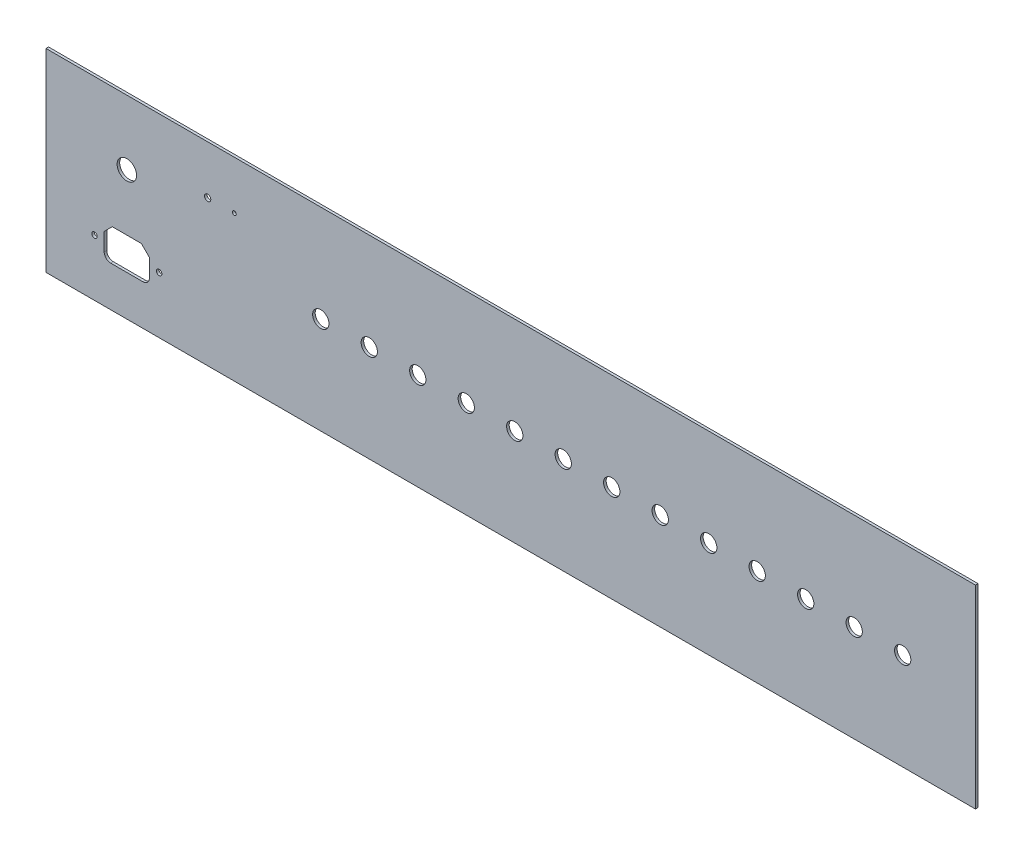
ISO-10303-21;
HEADER;
FILE_DESCRIPTION(('STEP AP214'),'2;1');
FILE_NAME('part.step','',(''),(''),'','','');
FILE_SCHEMA(('AUTOMOTIVE_DESIGN { 1 0 10303 214 1 1 1 1 }'));
ENDSEC;
DATA;
#1=APPLICATION_CONTEXT('core data for automotive mechanical design processes');
#2=APPLICATION_PROTOCOL_DEFINITION('international standard','automotive_design',2000,#1);
#3=PRODUCT_CONTEXT('',#1,'mechanical');
#4=PRODUCT('Part','Part','',(#3));
#5=PRODUCT_RELATED_PRODUCT_CATEGORY('part','',(#4));
#6=PRODUCT_DEFINITION_FORMATION('','',#4);
#7=PRODUCT_DEFINITION_CONTEXT('part definition',#1,'design');
#8=PRODUCT_DEFINITION('design','',#6,#7);
#9=PRODUCT_DEFINITION_SHAPE('','',#8);
#10=(LENGTH_UNIT() NAMED_UNIT(*) SI_UNIT(.MILLI.,.METRE.));
#11=(NAMED_UNIT(*) PLANE_ANGLE_UNIT() SI_UNIT($,.RADIAN.));
#12=(NAMED_UNIT(*) SI_UNIT($,.STERADIAN.) SOLID_ANGLE_UNIT());
#13=UNCERTAINTY_MEASURE_WITH_UNIT(LENGTH_MEASURE(1.E-05),#10,'distance_accuracy_value','');
#14=(GEOMETRIC_REPRESENTATION_CONTEXT(3) GLOBAL_UNCERTAINTY_ASSIGNED_CONTEXT((#13)) GLOBAL_UNIT_ASSIGNED_CONTEXT((#10,
#11,#12)) REPRESENTATION_CONTEXT('',''));
#15=CARTESIAN_POINT('',(0.,0.,0.));
#16=DIRECTION('',(0.,0.,1.));
#17=DIRECTION('',(1.,0.,0.));
#18=AXIS2_PLACEMENT_3D('',#15,#16,#17);
#19=CARTESIAN_POINT('',(242.5,0.,1.5875));
#20=DIRECTION('',(0.,0.,1.));
#21=DIRECTION('',(1.,0.,0.));
#22=AXIS2_PLACEMENT_3D('',#19,#20,#21);
#23=CYLINDRICAL_SURFACE('',#22,5.0419);
#24=CARTESIAN_POINT('',(242.5,0.,0.));
#25=DIRECTION('',(0.,0.,1.));
#26=DIRECTION('',(1.,0.,0.));
#27=AXIS2_PLACEMENT_3D('',#24,#25,#26);
#28=CIRCLE('',#27,5.0419);
#29=CARTESIAN_POINT('',(247.5419,0.,0.));
#30=VERTEX_POINT('',#29);
#31=EDGE_CURVE('E214',#30,#30,#28,.T.);
#32=ORIENTED_EDGE('',*,*,#31,.F.);
#33=EDGE_LOOP('',(#32));
#34=FACE_BOUND('',#33,.T.);
#35=CARTESIAN_POINT('',(242.5,0.,1.5875));
#36=DIRECTION('',(0.,0.,1.));
#37=DIRECTION('',(1.,0.,0.));
#38=AXIS2_PLACEMENT_3D('',#35,#36,#37);
#39=CIRCLE('',#38,5.0419);
#40=CARTESIAN_POINT('',(247.5419,0.,1.5875));
#41=VERTEX_POINT('',#40);
#42=EDGE_CURVE('E217',#41,#41,#39,.T.);
#43=ORIENTED_EDGE('',*,*,#42,.T.);
#44=EDGE_LOOP('',(#43));
#45=FACE_BOUND('',#44,.T.);
#46=ADVANCED_FACE('F34',(#34,#45),#23,.F.);
#47=CARTESIAN_POINT('',(212.5,0.,1.5875));
#48=DIRECTION('',(0.,0.,1.));
#49=DIRECTION('',(1.,0.,0.));
#50=AXIS2_PLACEMENT_3D('',#47,#48,#49);
#51=CYLINDRICAL_SURFACE('',#50,5.0419);
#52=CARTESIAN_POINT('',(212.5,0.,0.));
#53=DIRECTION('',(0.,0.,1.));
#54=DIRECTION('',(1.,0.,0.));
#55=AXIS2_PLACEMENT_3D('',#52,#53,#54);
#56=CIRCLE('',#55,5.0419);
#57=CARTESIAN_POINT('',(217.5419,0.,0.));
#58=VERTEX_POINT('',#57);
#59=EDGE_CURVE('E208',#58,#58,#56,.T.);
#60=ORIENTED_EDGE('',*,*,#59,.F.);
#61=EDGE_LOOP('',(#60));
#62=FACE_BOUND('',#61,.T.);
#63=CARTESIAN_POINT('',(212.5,0.,1.5875));
#64=DIRECTION('',(0.,0.,1.));
#65=DIRECTION('',(1.,0.,0.));
#66=AXIS2_PLACEMENT_3D('',#63,#64,#65);
#67=CIRCLE('',#66,5.0419);
#68=CARTESIAN_POINT('',(217.5419,0.,1.5875));
#69=VERTEX_POINT('',#68);
#70=EDGE_CURVE('E211',#69,#69,#67,.T.);
#71=ORIENTED_EDGE('',*,*,#70,.T.);
#72=EDGE_LOOP('',(#71));
#73=FACE_BOUND('',#72,.T.);
#74=ADVANCED_FACE('F350',(#62,#73),#51,.F.);
#75=CARTESIAN_POINT('',(182.5,0.,1.5875));
#76=DIRECTION('',(0.,0.,1.));
#77=DIRECTION('',(1.,0.,0.));
#78=AXIS2_PLACEMENT_3D('',#75,#76,#77);
#79=CYLINDRICAL_SURFACE('',#78,5.0419);
#80=CARTESIAN_POINT('',(182.5,0.,0.));
#81=DIRECTION('',(0.,0.,1.));
#82=DIRECTION('',(1.,0.,0.));
#83=AXIS2_PLACEMENT_3D('',#80,#81,#82);
#84=CIRCLE('',#83,5.0419);
#85=CARTESIAN_POINT('',(187.5419,0.,0.));
#86=VERTEX_POINT('',#85);
#87=EDGE_CURVE('E202',#86,#86,#84,.T.);
#88=ORIENTED_EDGE('',*,*,#87,.F.);
#89=EDGE_LOOP('',(#88));
#90=FACE_BOUND('',#89,.T.);
#91=CARTESIAN_POINT('',(182.5,0.,1.5875));
#92=DIRECTION('',(0.,0.,1.));
#93=DIRECTION('',(1.,0.,0.));
#94=AXIS2_PLACEMENT_3D('',#91,#92,#93);
#95=CIRCLE('',#94,5.0419);
#96=CARTESIAN_POINT('',(187.5419,0.,1.5875));
#97=VERTEX_POINT('',#96);
#98=EDGE_CURVE('E205',#97,#97,#95,.T.);
#99=ORIENTED_EDGE('',*,*,#98,.T.);
#100=EDGE_LOOP('',(#99));
#101=FACE_BOUND('',#100,.T.);
#102=ADVANCED_FACE('F356',(#90,#101),#79,.F.);
#103=CARTESIAN_POINT('',(152.5,0.,1.5875));
#104=DIRECTION('',(0.,0.,1.));
#105=DIRECTION('',(1.,0.,0.));
#106=AXIS2_PLACEMENT_3D('',#103,#104,#105);
#107=CYLINDRICAL_SURFACE('',#106,5.0419);
#108=CARTESIAN_POINT('',(152.5,0.,0.));
#109=DIRECTION('',(0.,0.,1.));
#110=DIRECTION('',(1.,0.,0.));
#111=AXIS2_PLACEMENT_3D('',#108,#109,#110);
#112=CIRCLE('',#111,5.0419);
#113=CARTESIAN_POINT('',(157.5419,0.,0.));
#114=VERTEX_POINT('',#113);
#115=EDGE_CURVE('E196',#114,#114,#112,.T.);
#116=ORIENTED_EDGE('',*,*,#115,.F.);
#117=EDGE_LOOP('',(#116));
#118=FACE_BOUND('',#117,.T.);
#119=CARTESIAN_POINT('',(152.5,0.,1.5875));
#120=DIRECTION('',(0.,0.,1.));
#121=DIRECTION('',(1.,0.,0.));
#122=AXIS2_PLACEMENT_3D('',#119,#120,#121);
#123=CIRCLE('',#122,5.0419);
#124=CARTESIAN_POINT('',(157.5419,0.,1.5875));
#125=VERTEX_POINT('',#124);
#126=EDGE_CURVE('E199',#125,#125,#123,.T.);
#127=ORIENTED_EDGE('',*,*,#126,.T.);
#128=EDGE_LOOP('',(#127));
#129=FACE_BOUND('',#128,.T.);
#130=ADVANCED_FACE('F592',(#118,#129),#107,.F.);
#131=CARTESIAN_POINT('',(122.5,0.,1.5875));
#132=DIRECTION('',(0.,0.,1.));
#133=DIRECTION('',(1.,0.,0.));
#134=AXIS2_PLACEMENT_3D('',#131,#132,#133);
#135=CYLINDRICAL_SURFACE('',#134,5.0419);
#136=CARTESIAN_POINT('',(122.5,0.,0.));
#137=DIRECTION('',(0.,0.,1.));
#138=DIRECTION('',(1.,0.,0.));
#139=AXIS2_PLACEMENT_3D('',#136,#137,#138);
#140=CIRCLE('',#139,5.0419);
#141=CARTESIAN_POINT('',(127.5419,0.,0.));
#142=VERTEX_POINT('',#141);
#143=EDGE_CURVE('E190',#142,#142,#140,.T.);
#144=ORIENTED_EDGE('',*,*,#143,.F.);
#145=EDGE_LOOP('',(#144));
#146=FACE_BOUND('',#145,.T.);
#147=CARTESIAN_POINT('',(122.5,0.,1.5875));
#148=DIRECTION('',(0.,0.,1.));
#149=DIRECTION('',(1.,0.,0.));
#150=AXIS2_PLACEMENT_3D('',#147,#148,#149);
#151=CIRCLE('',#150,5.0419);
#152=CARTESIAN_POINT('',(127.5419,0.,1.5875));
#153=VERTEX_POINT('',#152);
#154=EDGE_CURVE('E193',#153,#153,#151,.T.);
#155=ORIENTED_EDGE('',*,*,#154,.T.);
#156=EDGE_LOOP('',(#155));
#157=FACE_BOUND('',#156,.T.);
#158=ADVANCED_FACE('F583',(#146,#157),#135,.F.);
#159=CARTESIAN_POINT('',(92.5000000000001,0.,1.5875));
#160=DIRECTION('',(0.,0.,1.));
#161=DIRECTION('',(1.,0.,0.));
#162=AXIS2_PLACEMENT_3D('',#159,#160,#161);
#163=CYLINDRICAL_SURFACE('',#162,5.0419);
#164=CARTESIAN_POINT('',(92.5000000000001,0.,0.));
#165=DIRECTION('',(0.,0.,1.));
#166=DIRECTION('',(1.,0.,0.));
#167=AXIS2_PLACEMENT_3D('',#164,#165,#166);
#168=CIRCLE('',#167,5.0419);
#169=CARTESIAN_POINT('',(97.5419000000001,0.,0.));
#170=VERTEX_POINT('',#169);
#171=EDGE_CURVE('E184',#170,#170,#168,.T.);
#172=ORIENTED_EDGE('',*,*,#171,.F.);
#173=EDGE_LOOP('',(#172));
#174=FACE_BOUND('',#173,.T.);
#175=CARTESIAN_POINT('',(92.5000000000001,0.,1.5875));
#176=DIRECTION('',(0.,0.,1.));
#177=DIRECTION('',(1.,0.,0.));
#178=AXIS2_PLACEMENT_3D('',#175,#176,#177);
#179=CIRCLE('',#178,5.0419);
#180=CARTESIAN_POINT('',(97.5419000000001,0.,1.5875));
#181=VERTEX_POINT('',#180);
#182=EDGE_CURVE('E187',#181,#181,#179,.T.);
#183=ORIENTED_EDGE('',*,*,#182,.T.);
#184=EDGE_LOOP('',(#183));
#185=FACE_BOUND('',#184,.T.);
#186=ADVANCED_FACE('F574',(#174,#185),#163,.F.);
#187=CARTESIAN_POINT('',(62.5000000000001,0.,1.5875));
#188=DIRECTION('',(0.,0.,1.));
#189=DIRECTION('',(1.,0.,0.));
#190=AXIS2_PLACEMENT_3D('',#187,#188,#189);
#191=CYLINDRICAL_SURFACE('',#190,5.0419);
#192=CARTESIAN_POINT('',(62.5000000000001,0.,0.));
#193=DIRECTION('',(0.,0.,1.));
#194=DIRECTION('',(1.,0.,0.));
#195=AXIS2_PLACEMENT_3D('',#192,#193,#194);
#196=CIRCLE('',#195,5.0419);
#197=CARTESIAN_POINT('',(67.5419000000001,0.,0.));
#198=VERTEX_POINT('',#197);
#199=EDGE_CURVE('E178',#198,#198,#196,.T.);
#200=ORIENTED_EDGE('',*,*,#199,.F.);
#201=EDGE_LOOP('',(#200));
#202=FACE_BOUND('',#201,.T.);
#203=CARTESIAN_POINT('',(62.5000000000001,0.,1.5875));
#204=DIRECTION('',(0.,0.,1.));
#205=DIRECTION('',(1.,0.,0.));
#206=AXIS2_PLACEMENT_3D('',#203,#204,#205);
#207=CIRCLE('',#206,5.0419);
#208=CARTESIAN_POINT('',(67.5419000000001,0.,1.5875));
#209=VERTEX_POINT('',#208);
#210=EDGE_CURVE('E181',#209,#209,#207,.T.);
#211=ORIENTED_EDGE('',*,*,#210,.T.);
#212=EDGE_LOOP('',(#211));
#213=FACE_BOUND('',#212,.T.);
#214=ADVANCED_FACE('F565',(#202,#213),#191,.F.);
#215=CARTESIAN_POINT('',(32.5000000000001,0.,1.5875));
#216=DIRECTION('',(0.,0.,1.));
#217=DIRECTION('',(1.,0.,0.));
#218=AXIS2_PLACEMENT_3D('',#215,#216,#217);
#219=CYLINDRICAL_SURFACE('',#218,5.0419);
#220=CARTESIAN_POINT('',(32.5000000000001,0.,0.));
#221=DIRECTION('',(0.,0.,1.));
#222=DIRECTION('',(1.,0.,0.));
#223=AXIS2_PLACEMENT_3D('',#220,#221,#222);
#224=CIRCLE('',#223,5.0419);
#225=CARTESIAN_POINT('',(37.5419000000001,0.,0.));
#226=VERTEX_POINT('',#225);
#227=EDGE_CURVE('E172',#226,#226,#224,.T.);
#228=ORIENTED_EDGE('',*,*,#227,.F.);
#229=EDGE_LOOP('',(#228));
#230=FACE_BOUND('',#229,.T.);
#231=CARTESIAN_POINT('',(32.5000000000001,0.,1.5875));
#232=DIRECTION('',(0.,0.,1.));
#233=DIRECTION('',(1.,0.,0.));
#234=AXIS2_PLACEMENT_3D('',#231,#232,#233);
#235=CIRCLE('',#234,5.0419);
#236=CARTESIAN_POINT('',(37.5419000000001,0.,1.5875));
#237=VERTEX_POINT('',#236);
#238=EDGE_CURVE('E175',#237,#237,#235,.T.);
#239=ORIENTED_EDGE('',*,*,#238,.T.);
#240=EDGE_LOOP('',(#239));
#241=FACE_BOUND('',#240,.T.);
#242=ADVANCED_FACE('F556',(#230,#241),#219,.F.);
#243=CARTESIAN_POINT('',(2.50000000000009,0.,1.5875));
#244=DIRECTION('',(0.,0.,1.));
#245=DIRECTION('',(1.,0.,0.));
#246=AXIS2_PLACEMENT_3D('',#243,#244,#245);
#247=CYLINDRICAL_SURFACE('',#246,5.0419);
#248=CARTESIAN_POINT('',(2.50000000000009,0.,0.));
#249=DIRECTION('',(0.,0.,1.));
#250=DIRECTION('',(1.,0.,0.));
#251=AXIS2_PLACEMENT_3D('',#248,#249,#250);
#252=CIRCLE('',#251,5.0419);
#253=CARTESIAN_POINT('',(7.54190000000009,0.,0.));
#254=VERTEX_POINT('',#253);
#255=EDGE_CURVE('E166',#254,#254,#252,.T.);
#256=ORIENTED_EDGE('',*,*,#255,.F.);
#257=EDGE_LOOP('',(#256));
#258=FACE_BOUND('',#257,.T.);
#259=CARTESIAN_POINT('',(2.50000000000009,0.,1.5875));
#260=DIRECTION('',(0.,0.,1.));
#261=DIRECTION('',(1.,0.,0.));
#262=AXIS2_PLACEMENT_3D('',#259,#260,#261);
#263=CIRCLE('',#262,5.0419);
#264=CARTESIAN_POINT('',(7.54190000000009,0.,1.5875));
#265=VERTEX_POINT('',#264);
#266=EDGE_CURVE('E169',#265,#265,#263,.T.);
#267=ORIENTED_EDGE('',*,*,#266,.T.);
#268=EDGE_LOOP('',(#267));
#269=FACE_BOUND('',#268,.T.);
#270=ADVANCED_FACE('F547',(#258,#269),#247,.F.);
#271=CARTESIAN_POINT('',(-27.4999999999999,0.,1.5875));
#272=DIRECTION('',(0.,0.,1.));
#273=DIRECTION('',(1.,0.,0.));
#274=AXIS2_PLACEMENT_3D('',#271,#272,#273);
#275=CYLINDRICAL_SURFACE('',#274,5.0419);
#276=CARTESIAN_POINT('',(-27.4999999999999,0.,0.));
#277=DIRECTION('',(0.,0.,1.));
#278=DIRECTION('',(1.,0.,0.));
#279=AXIS2_PLACEMENT_3D('',#276,#277,#278);
#280=CIRCLE('',#279,5.0419);
#281=CARTESIAN_POINT('',(-22.4580999999999,0.,0.));
#282=VERTEX_POINT('',#281);
#283=EDGE_CURVE('E160',#282,#282,#280,.T.);
#284=ORIENTED_EDGE('',*,*,#283,.F.);
#285=EDGE_LOOP('',(#284));
#286=FACE_BOUND('',#285,.T.);
#287=CARTESIAN_POINT('',(-27.4999999999999,0.,1.5875));
#288=DIRECTION('',(0.,0.,1.));
#289=DIRECTION('',(1.,0.,0.));
#290=AXIS2_PLACEMENT_3D('',#287,#288,#289);
#291=CIRCLE('',#290,5.0419);
#292=CARTESIAN_POINT('',(-22.4580999999999,0.,1.5875));
#293=VERTEX_POINT('',#292);
#294=EDGE_CURVE('E163',#293,#293,#291,.T.);
#295=ORIENTED_EDGE('',*,*,#294,.T.);
#296=EDGE_LOOP('',(#295));
#297=FACE_BOUND('',#296,.T.);
#298=ADVANCED_FACE('F538',(#286,#297),#275,.F.);
#299=CARTESIAN_POINT('',(-57.4999999999999,0.,1.5875));
#300=DIRECTION('',(0.,0.,1.));
#301=DIRECTION('',(1.,0.,0.));
#302=AXIS2_PLACEMENT_3D('',#299,#300,#301);
#303=CYLINDRICAL_SURFACE('',#302,5.0419);
#304=CARTESIAN_POINT('',(-57.4999999999999,0.,0.));
#305=DIRECTION('',(0.,0.,1.));
#306=DIRECTION('',(1.,0.,0.));
#307=AXIS2_PLACEMENT_3D('',#304,#305,#306);
#308=CIRCLE('',#307,5.0419);
#309=CARTESIAN_POINT('',(-52.4580999999999,0.,0.));
#310=VERTEX_POINT('',#309);
#311=EDGE_CURVE('E149',#310,#310,#308,.T.);
#312=ORIENTED_EDGE('',*,*,#311,.F.);
#313=EDGE_LOOP('',(#312));
#314=FACE_BOUND('',#313,.T.);
#315=CARTESIAN_POINT('',(-57.4999999999999,0.,1.5875));
#316=DIRECTION('',(0.,0.,1.));
#317=DIRECTION('',(1.,0.,0.));
#318=AXIS2_PLACEMENT_3D('',#315,#316,#317);
#319=CIRCLE('',#318,5.0419);
#320=CARTESIAN_POINT('',(-52.4580999999999,0.,1.5875));
#321=VERTEX_POINT('',#320);
#322=EDGE_CURVE('E152',#321,#321,#319,.T.);
#323=ORIENTED_EDGE('',*,*,#322,.T.);
#324=EDGE_LOOP('',(#323));
#325=FACE_BOUND('',#324,.T.);
#326=ADVANCED_FACE('F533',(#314,#325),#303,.F.);
#327=CARTESIAN_POINT('',(-287.5,-60.,1.5875));
#328=DIRECTION('',(1.,0.,0.));
#329=DIRECTION('',(0.,0.,-1.));
#330=AXIS2_PLACEMENT_3D('',#327,#328,#329);
#331=PLANE('',#330);
#332=DIRECTION('',(0.,-1.,0.));
#333=VECTOR('',#332,1.);
#334=CARTESIAN_POINT('',(-287.5,-60.,0.));
#335=LINE('',#334,#333);
#336=CARTESIAN_POINT('',(-287.5,60.,0.));
#337=VERTEX_POINT('',#336);
#338=CARTESIAN_POINT('',(-287.5,-60.,0.));
#339=VERTEX_POINT('',#338);
#340=EDGE_CURVE('E148',#337,#339,#335,.T.);
#341=ORIENTED_EDGE('',*,*,#340,.T.);
#342=DIRECTION('',(0.,0.,-1.));
#343=VECTOR('',#342,1.);
#344=CARTESIAN_POINT('',(-287.5,-60.,1.5875));
#345=LINE('',#344,#343);
#346=CARTESIAN_POINT('',(-287.5,-60.,1.5875));
#347=VERTEX_POINT('',#346);
#348=EDGE_CURVE('E127',#347,#339,#345,.T.);
#349=ORIENTED_EDGE('',*,*,#348,.F.);
#350=DIRECTION('',(0.,-1.,0.));
#351=VECTOR('',#350,1.);
#352=CARTESIAN_POINT('',(-287.5,-60.,1.5875));
#353=LINE('',#352,#351);
#354=CARTESIAN_POINT('',(-287.5,60.,1.5875));
#355=VERTEX_POINT('',#354);
#356=EDGE_CURVE('E134',#355,#347,#353,.T.);
#357=ORIENTED_EDGE('',*,*,#356,.F.);
#358=DIRECTION('',(0.,0.,-1.));
#359=VECTOR('',#358,1.);
#360=CARTESIAN_POINT('',(-287.5,60.,1.5875));
#361=LINE('',#360,#359);
#362=EDGE_CURVE('E323',#355,#337,#361,.T.);
#363=ORIENTED_EDGE('',*,*,#362,.T.);
#364=EDGE_LOOP('',(#341,#349,#357,#363));
#365=FACE_BOUND('',#364,.T.);
#366=ADVANCED_FACE('F146',(#365),#331,.F.);
#367=CARTESIAN_POINT('',(287.5,-60.,1.5875));
#368=DIRECTION('',(0.,1.,0.));
#369=DIRECTION('',(-1.,0.,0.));
#370=AXIS2_PLACEMENT_3D('',#367,#368,#369);
#371=PLANE('',#370);
#372=DIRECTION('',(1.,0.,0.));
#373=VECTOR('',#372,1.);
#374=CARTESIAN_POINT('',(287.5,-60.,0.));
#375=LINE('',#374,#373);
#376=CARTESIAN_POINT('',(287.5,-60.,0.));
#377=VERTEX_POINT('',#376);
#378=EDGE_CURVE('E325',#339,#377,#375,.T.);
#379=ORIENTED_EDGE('',*,*,#378,.T.);
#380=DIRECTION('',(0.,0.,-1.));
#381=VECTOR('',#380,1.);
#382=CARTESIAN_POINT('',(287.5,-60.,1.5875));
#383=LINE('',#382,#381);
#384=CARTESIAN_POINT('',(287.5,-60.,1.5875));
#385=VERTEX_POINT('',#384);
#386=EDGE_CURVE('E130',#385,#377,#383,.T.);
#387=ORIENTED_EDGE('',*,*,#386,.F.);
#388=DIRECTION('',(1.,0.,0.));
#389=VECTOR('',#388,1.);
#390=CARTESIAN_POINT('',(287.5,-60.,1.5875));
#391=LINE('',#390,#389);
#392=EDGE_CURVE('E123',#347,#385,#391,.T.);
#393=ORIENTED_EDGE('',*,*,#392,.F.);
#394=ORIENTED_EDGE('',*,*,#348,.T.);
#395=EDGE_LOOP('',(#379,#387,#393,#394));
#396=FACE_BOUND('',#395,.T.);
#397=ADVANCED_FACE('F125',(#396),#371,.F.);
#398=CARTESIAN_POINT('',(287.5,-60.,1.5875));
#399=DIRECTION('',(-1.,0.,0.));
#400=DIRECTION('',(0.,0.,1.));
#401=AXIS2_PLACEMENT_3D('',#398,#399,#400);
#402=PLANE('',#401);
#403=DIRECTION('',(0.,1.,0.));
#404=VECTOR('',#403,1.);
#405=CARTESIAN_POINT('',(287.5,-60.,0.));
#406=LINE('',#405,#404);
#407=CARTESIAN_POINT('',(287.5,60.,0.));
#408=VERTEX_POINT('',#407);
#409=EDGE_CURVE('E327',#377,#408,#406,.T.);
#410=ORIENTED_EDGE('',*,*,#409,.T.);
#411=DIRECTION('',(0.,0.,-1.));
#412=VECTOR('',#411,1.);
#413=CARTESIAN_POINT('',(287.5,60.,1.5875));
#414=LINE('',#413,#412);
#415=CARTESIAN_POINT('',(287.5,60.,1.5875));
#416=VERTEX_POINT('',#415);
#417=EDGE_CURVE('E154',#416,#408,#414,.T.);
#418=ORIENTED_EDGE('',*,*,#417,.F.);
#419=DIRECTION('',(0.,1.,0.));
#420=VECTOR('',#419,1.);
#421=CARTESIAN_POINT('',(287.5,-60.,1.5875));
#422=LINE('',#421,#420);
#423=EDGE_CURVE('E133',#385,#416,#422,.T.);
#424=ORIENTED_EDGE('',*,*,#423,.F.);
#425=ORIENTED_EDGE('',*,*,#386,.T.);
#426=EDGE_LOOP('',(#410,#418,#424,#425));
#427=FACE_BOUND('',#426,.T.);
#428=ADVANCED_FACE('F340',(#427),#402,.F.);
#429=CARTESIAN_POINT('',(287.5,60.,1.5875));
#430=DIRECTION('',(0.,-1.,0.));
#431=DIRECTION('',(1.,0.,0.));
#432=AXIS2_PLACEMENT_3D('',#429,#430,#431);
#433=PLANE('',#432);
#434=DIRECTION('',(-1.,0.,0.));
#435=VECTOR('',#434,1.);
#436=CARTESIAN_POINT('',(287.5,60.,0.));
#437=LINE('',#436,#435);
#438=EDGE_CURVE('E144',#408,#337,#437,.T.);
#439=ORIENTED_EDGE('',*,*,#438,.T.);
#440=ORIENTED_EDGE('',*,*,#362,.F.);
#441=DIRECTION('',(-1.,0.,0.));
#442=VECTOR('',#441,1.);
#443=CARTESIAN_POINT('',(287.5,60.,1.5875));
#444=LINE('',#443,#442);
#445=EDGE_CURVE('E140',#416,#355,#444,.T.);
#446=ORIENTED_EDGE('',*,*,#445,.F.);
#447=ORIENTED_EDGE('',*,*,#417,.T.);
#448=EDGE_LOOP('',(#439,#440,#446,#447));
#449=FACE_BOUND('',#448,.T.);
#450=ADVANCED_FACE('F334',(#449),#433,.F.);
#451=CARTESIAN_POINT('',(0.,0.,1.5875));
#452=DIRECTION('',(0.,0.,1.));
#453=DIRECTION('',(1.,0.,0.));
#454=AXIS2_PLACEMENT_3D('',#451,#452,#453);
#455=PLANE('',#454);
#456=CARTESIAN_POINT('',(-237.5,20.,1.5875));
#457=DIRECTION('',(0.,0.,1.));
#458=DIRECTION('',(1.,0.,0.));
#459=AXIS2_PLACEMENT_3D('',#456,#457,#458);
#460=CIRCLE('',#459,6.00000000000002);
#461=CARTESIAN_POINT('',(-231.5,20.,1.5875));
#462=VERTEX_POINT('',#461);
#463=EDGE_CURVE('E388',#462,#462,#460,.T.);
#464=ORIENTED_EDGE('',*,*,#463,.F.);
#465=EDGE_LOOP('',(#464));
#466=FACE_BOUND('',#465,.T.);
#467=DIRECTION('',(0.,-1.,0.));
#468=VECTOR('',#467,1.);
#469=CARTESIAN_POINT('',(-251.5,-34.9999999999998,1.5875));
#470=LINE('',#469,#468);
#471=CARTESIAN_POINT('',(-251.5,-19.9999999999999,1.5875));
#472=VERTEX_POINT('',#471);
#473=CARTESIAN_POINT('',(-251.5,-30.9999999999998,1.5875));
#474=VERTEX_POINT('',#473);
#475=EDGE_CURVE('E258',#472,#474,#470,.T.);
#476=ORIENTED_EDGE('',*,*,#475,.F.);
#477=DIRECTION('',(-0.70710678118654,-0.707106781186556,0.));
#478=VECTOR('',#477,1.);
#479=CARTESIAN_POINT('',(-251.5,-19.9999999999999,1.5875));
#480=LINE('',#479,#478);
#481=CARTESIAN_POINT('',(-246.5,-14.9999999999998,1.5875));
#482=VERTEX_POINT('',#481);
#483=EDGE_CURVE('E42',#472,#482,#480,.F.);
#484=ORIENTED_EDGE('',*,*,#483,.T.);
#485=DIRECTION('',(-1.,0.,0.));
#486=VECTOR('',#485,1.);
#487=CARTESIAN_POINT('',(-223.5,-14.9999999999998,1.5875));
#488=LINE('',#487,#486);
#489=CARTESIAN_POINT('',(-228.5,-14.9999999999998,1.5875));
#490=VERTEX_POINT('',#489);
#491=EDGE_CURVE('E257',#490,#482,#488,.T.);
#492=ORIENTED_EDGE('',*,*,#491,.F.);
#493=DIRECTION('',(-0.707106781186556,0.70710678118654,0.));
#494=VECTOR('',#493,1.);
#495=CARTESIAN_POINT('',(-228.5,-14.9999999999998,1.5875));
#496=LINE('',#495,#494);
#497=CARTESIAN_POINT('',(-223.5,-19.9999999999997,1.5875));
#498=VERTEX_POINT('',#497);
#499=EDGE_CURVE('E249',#490,#498,#496,.F.);
#500=ORIENTED_EDGE('',*,*,#499,.T.);
#501=DIRECTION('',(0.,1.,0.));
#502=VECTOR('',#501,1.);
#503=CARTESIAN_POINT('',(-223.5,-34.9999999999998,1.5875));
#504=LINE('',#503,#502);
#505=CARTESIAN_POINT('',(-223.5,-30.9999999999998,1.5875));
#506=VERTEX_POINT('',#505);
#507=EDGE_CURVE('E264',#506,#498,#504,.T.);
#508=ORIENTED_EDGE('',*,*,#507,.F.);
#509=CARTESIAN_POINT('',(-227.5,-30.9999999999998,1.5875));
#510=DIRECTION('',(0.,0.,1.));
#511=DIRECTION('',(1.,0.,0.));
#512=AXIS2_PLACEMENT_3D('',#509,#510,#511);
#513=CIRCLE('',#512,4.);
#514=CARTESIAN_POINT('',(-227.5,-34.9999999999998,1.5875));
#515=VERTEX_POINT('',#514);
#516=EDGE_CURVE('E230',#506,#515,#513,.F.);
#517=ORIENTED_EDGE('',*,*,#516,.T.);
#518=DIRECTION('',(1.,0.,0.));
#519=VECTOR('',#518,1.);
#520=CARTESIAN_POINT('',(-223.5,-34.9999999999998,1.5875));
#521=LINE('',#520,#519);
#522=CARTESIAN_POINT('',(-247.5,-34.9999999999998,1.5875));
#523=VERTEX_POINT('',#522);
#524=EDGE_CURVE('E273',#523,#515,#521,.T.);
#525=ORIENTED_EDGE('',*,*,#524,.F.);
#526=CARTESIAN_POINT('',(-247.5,-30.9999999999998,1.5875));
#527=DIRECTION('',(0.,0.,1.));
#528=DIRECTION('',(1.,0.,0.));
#529=AXIS2_PLACEMENT_3D('',#526,#527,#528);
#530=CIRCLE('',#529,4.);
#531=EDGE_CURVE('E235',#523,#474,#530,.F.);
#532=ORIENTED_EDGE('',*,*,#531,.T.);
#533=EDGE_LOOP('',(#476,#484,#492,#500,#508,#517,#525,#532));
#534=FACE_BOUND('',#533,.T.);
#535=CARTESIAN_POINT('',(-187.5,30.,1.5875));
#536=DIRECTION('',(0.,0.,1.));
#537=DIRECTION('',(1.,0.,0.));
#538=AXIS2_PLACEMENT_3D('',#535,#536,#537);
#539=CIRCLE('',#538,1.95000000000003);
#540=CARTESIAN_POINT('',(-185.55,30.,1.5875));
#541=VERTEX_POINT('',#540);
#542=EDGE_CURVE('E286',#541,#541,#539,.T.);
#543=ORIENTED_EDGE('',*,*,#542,.F.);
#544=EDGE_LOOP('',(#543));
#545=FACE_BOUND('',#544,.T.);
#546=CARTESIAN_POINT('',(-170.99,30.0000000000001,1.5875));
#547=DIRECTION('',(0.,0.,1.));
#548=DIRECTION('',(1.,0.,0.));
#549=AXIS2_PLACEMENT_3D('',#546,#547,#548);
#550=CIRCLE('',#549,1.20000000000001);
#551=CARTESIAN_POINT('',(-169.79,30.0000000000001,1.5875));
#552=VERTEX_POINT('',#551);
#553=EDGE_CURVE('E285',#552,#552,#550,.T.);
#554=ORIENTED_EDGE('',*,*,#553,.F.);
#555=EDGE_LOOP('',(#554));
#556=FACE_BOUND('',#555,.T.);
#557=CARTESIAN_POINT('',(-87.4999999999999,0.,1.5875));
#558=DIRECTION('',(0.,0.,1.));
#559=DIRECTION('',(1.,0.,0.));
#560=AXIS2_PLACEMENT_3D('',#557,#558,#559);
#561=CIRCLE('',#560,5.0419);
#562=CARTESIAN_POINT('',(-82.4580999999999,0.,1.5875));
#563=VERTEX_POINT('',#562);
#564=EDGE_CURVE('E300',#563,#563,#561,.T.);
#565=ORIENTED_EDGE('',*,*,#564,.F.);
#566=EDGE_LOOP('',(#565));
#567=FACE_BOUND('',#566,.T.);
#568=CARTESIAN_POINT('',(-117.5,0.,1.5875));
#569=DIRECTION('',(0.,0.,1.));
#570=DIRECTION('',(1.,0.,0.));
#571=AXIS2_PLACEMENT_3D('',#568,#569,#570);
#572=CIRCLE('',#571,5.0419);
#573=CARTESIAN_POINT('',(-112.4581,0.,1.5875));
#574=VERTEX_POINT('',#573);
#575=EDGE_CURVE('E303',#574,#574,#572,.T.);
#576=ORIENTED_EDGE('',*,*,#575,.F.);
#577=EDGE_LOOP('',(#576));
#578=FACE_BOUND('',#577,.T.);
#579=CARTESIAN_POINT('',(-257.5,-25.,1.5875));
#580=DIRECTION('',(0.,0.,1.));
#581=DIRECTION('',(1.,0.,0.));
#582=AXIS2_PLACEMENT_3D('',#579,#580,#581);
#583=CIRCLE('',#582,1.69999999999998);
#584=CARTESIAN_POINT('',(-255.8,-25.,1.5875));
#585=VERTEX_POINT('',#584);
#586=EDGE_CURVE('E309',#585,#585,#583,.T.);
#587=ORIENTED_EDGE('',*,*,#586,.F.);
#588=EDGE_LOOP('',(#587));
#589=FACE_BOUND('',#588,.T.);
#590=CARTESIAN_POINT('',(-217.5,-24.9999999999998,1.5875));
#591=DIRECTION('',(0.,0.,1.));
#592=DIRECTION('',(1.,0.,0.));
#593=AXIS2_PLACEMENT_3D('',#590,#591,#592);
#594=CIRCLE('',#593,1.70000000000001);
#595=CARTESIAN_POINT('',(-215.8,-24.9999999999998,1.5875));
#596=VERTEX_POINT('',#595);
#597=EDGE_CURVE('E315',#596,#596,#594,.T.);
#598=ORIENTED_EDGE('',*,*,#597,.F.);
#599=EDGE_LOOP('',(#598));
#600=FACE_BOUND('',#599,.T.);
#601=ORIENTED_EDGE('',*,*,#356,.T.);
#602=ORIENTED_EDGE('',*,*,#392,.T.);
#603=ORIENTED_EDGE('',*,*,#423,.T.);
#604=ORIENTED_EDGE('',*,*,#445,.T.);
#605=EDGE_LOOP('',(#601,#602,#603,#604));
#606=FACE_BOUND('',#605,.T.);
#607=ORIENTED_EDGE('',*,*,#322,.F.);
#608=EDGE_LOOP('',(#607));
#609=FACE_BOUND('',#608,.T.);
#610=ORIENTED_EDGE('',*,*,#294,.F.);
#611=EDGE_LOOP('',(#610));
#612=FACE_BOUND('',#611,.T.);
#613=ORIENTED_EDGE('',*,*,#266,.F.);
#614=EDGE_LOOP('',(#613));
#615=FACE_BOUND('',#614,.T.);
#616=ORIENTED_EDGE('',*,*,#238,.F.);
#617=EDGE_LOOP('',(#616));
#618=FACE_BOUND('',#617,.T.);
#619=ORIENTED_EDGE('',*,*,#210,.F.);
#620=EDGE_LOOP('',(#619));
#621=FACE_BOUND('',#620,.T.);
#622=ORIENTED_EDGE('',*,*,#182,.F.);
#623=EDGE_LOOP('',(#622));
#624=FACE_BOUND('',#623,.T.);
#625=ORIENTED_EDGE('',*,*,#154,.F.);
#626=EDGE_LOOP('',(#625));
#627=FACE_BOUND('',#626,.T.);
#628=ORIENTED_EDGE('',*,*,#126,.F.);
#629=EDGE_LOOP('',(#628));
#630=FACE_BOUND('',#629,.T.);
#631=ORIENTED_EDGE('',*,*,#98,.F.);
#632=EDGE_LOOP('',(#631));
#633=FACE_BOUND('',#632,.T.);
#634=ORIENTED_EDGE('',*,*,#70,.F.);
#635=EDGE_LOOP('',(#634));
#636=FACE_BOUND('',#635,.T.);
#637=ORIENTED_EDGE('',*,*,#42,.F.);
#638=EDGE_LOOP('',(#637));
#639=FACE_BOUND('',#638,.T.);
#640=ADVANCED_FACE('F137',(#466,#534,#545,#556,#567,#578,#589,#600,#606,#609,#612,#615,#618,
#621,#624,#627,#630,#633,#636,#639),#455,.T.);
#641=CARTESIAN_POINT('',(0.,0.,0.));
#642=DIRECTION('',(0.,0.,1.));
#643=DIRECTION('',(1.,0.,0.));
#644=AXIS2_PLACEMENT_3D('',#641,#642,#643);
#645=PLANE('',#644);
#646=CARTESIAN_POINT('',(-237.5,20.,0.));
#647=DIRECTION('',(0.,0.,1.));
#648=DIRECTION('',(1.,0.,0.));
#649=AXIS2_PLACEMENT_3D('',#646,#647,#648);
#650=CIRCLE('',#649,6.00000000000002);
#651=CARTESIAN_POINT('',(-231.5,20.,0.));
#652=VERTEX_POINT('',#651);
#653=EDGE_CURVE('E386',#652,#652,#650,.F.);
#654=ORIENTED_EDGE('',*,*,#653,.F.);
#655=EDGE_LOOP('',(#654));
#656=FACE_BOUND('',#655,.T.);
#657=DIRECTION('',(1.,0.,0.));
#658=VECTOR('',#657,1.);
#659=CARTESIAN_POINT('',(-223.5,-14.9999999999998,0.));
#660=LINE('',#659,#658);
#661=CARTESIAN_POINT('',(-246.5,-14.9999999999998,0.));
#662=VERTEX_POINT('',#661);
#663=CARTESIAN_POINT('',(-228.5,-14.9999999999998,0.));
#664=VERTEX_POINT('',#663);
#665=EDGE_CURVE('E271',#662,#664,#660,.T.);
#666=ORIENTED_EDGE('',*,*,#665,.F.);
#667=DIRECTION('',(0.70710678118654,0.707106781186556,0.));
#668=VECTOR('',#667,1.);
#669=CARTESIAN_POINT('',(-115.750000000003,115.75,0.));
#670=LINE('',#669,#668);
#671=CARTESIAN_POINT('',(-251.5,-19.9999999999999,0.));
#672=VERTEX_POINT('',#671);
#673=EDGE_CURVE('E11',#662,#672,#670,.F.);
#674=ORIENTED_EDGE('',*,*,#673,.T.);
#675=DIRECTION('',(0.,1.,0.));
#676=VECTOR('',#675,1.);
#677=CARTESIAN_POINT('',(-251.5,-34.9999999999998,0.));
#678=LINE('',#677,#676);
#679=CARTESIAN_POINT('',(-251.5,-30.9999999999998,0.));
#680=VERTEX_POINT('',#679);
#681=EDGE_CURVE('E268',#680,#672,#678,.T.);
#682=ORIENTED_EDGE('',*,*,#681,.F.);
#683=CARTESIAN_POINT('',(-247.5,-30.9999999999998,0.));
#684=DIRECTION('',(0.,0.,1.));
#685=DIRECTION('',(1.,0.,0.));
#686=AXIS2_PLACEMENT_3D('',#683,#684,#685);
#687=CIRCLE('',#686,4.);
#688=CARTESIAN_POINT('',(-247.5,-34.9999999999998,0.));
#689=VERTEX_POINT('',#688);
#690=EDGE_CURVE('E238',#680,#689,#687,.T.);
#691=ORIENTED_EDGE('',*,*,#690,.T.);
#692=DIRECTION('',(-1.,0.,0.));
#693=VECTOR('',#692,1.);
#694=CARTESIAN_POINT('',(-223.5,-34.9999999999998,0.));
#695=LINE('',#694,#693);
#696=CARTESIAN_POINT('',(-227.5,-34.9999999999998,0.));
#697=VERTEX_POINT('',#696);
#698=EDGE_CURVE('E263',#697,#689,#695,.T.);
#699=ORIENTED_EDGE('',*,*,#698,.F.);
#700=CARTESIAN_POINT('',(-227.5,-30.9999999999998,0.));
#701=DIRECTION('',(0.,0.,1.));
#702=DIRECTION('',(1.,0.,0.));
#703=AXIS2_PLACEMENT_3D('',#700,#701,#702);
#704=CIRCLE('',#703,4.);
#705=CARTESIAN_POINT('',(-223.5,-30.9999999999998,0.));
#706=VERTEX_POINT('',#705);
#707=EDGE_CURVE('E232',#697,#706,#704,.T.);
#708=ORIENTED_EDGE('',*,*,#707,.T.);
#709=DIRECTION('',(0.,-1.,0.));
#710=VECTOR('',#709,1.);
#711=CARTESIAN_POINT('',(-223.5,-34.9999999999998,0.));
#712=LINE('',#711,#710);
#713=CARTESIAN_POINT('',(-223.5,-19.9999999999997,0.));
#714=VERTEX_POINT('',#713);
#715=EDGE_CURVE('E275',#714,#706,#712,.T.);
#716=ORIENTED_EDGE('',*,*,#715,.F.);
#717=DIRECTION('',(0.707106781186556,-0.70710678118654,0.));
#718=VECTOR('',#717,1.);
#719=CARTESIAN_POINT('',(-121.749999999997,-121.75,0.));
#720=LINE('',#719,#718);
#721=EDGE_CURVE('E251',#714,#664,#720,.F.);
#722=ORIENTED_EDGE('',*,*,#721,.T.);
#723=EDGE_LOOP('',(#666,#674,#682,#691,#699,#708,#716,#722));
#724=FACE_BOUND('',#723,.T.);
#725=CARTESIAN_POINT('',(-187.5,30.,0.));
#726=DIRECTION('',(0.,0.,1.));
#727=DIRECTION('',(1.,0.,0.));
#728=AXIS2_PLACEMENT_3D('',#725,#726,#727);
#729=CIRCLE('',#728,1.95000000000003);
#730=CARTESIAN_POINT('',(-185.55,30.,0.));
#731=VERTEX_POINT('',#730);
#732=EDGE_CURVE('E289',#731,#731,#729,.F.);
#733=ORIENTED_EDGE('',*,*,#732,.F.);
#734=EDGE_LOOP('',(#733));
#735=FACE_BOUND('',#734,.T.);
#736=CARTESIAN_POINT('',(-170.99,30.0000000000001,0.));
#737=DIRECTION('',(0.,0.,1.));
#738=DIRECTION('',(1.,0.,0.));
#739=AXIS2_PLACEMENT_3D('',#736,#737,#738);
#740=CIRCLE('',#739,1.20000000000001);
#741=CARTESIAN_POINT('',(-169.79,30.0000000000001,0.));
#742=VERTEX_POINT('',#741);
#743=EDGE_CURVE('E290',#742,#742,#740,.F.);
#744=ORIENTED_EDGE('',*,*,#743,.F.);
#745=EDGE_LOOP('',(#744));
#746=FACE_BOUND('',#745,.T.);
#747=CARTESIAN_POINT('',(-87.4999999999999,0.,0.));
#748=DIRECTION('',(0.,0.,1.));
#749=DIRECTION('',(1.,0.,0.));
#750=AXIS2_PLACEMENT_3D('',#747,#748,#749);
#751=CIRCLE('',#750,5.0419);
#752=CARTESIAN_POINT('',(-82.4580999999999,0.,0.));
#753=VERTEX_POINT('',#752);
#754=EDGE_CURVE('E293',#753,#753,#751,.T.);
#755=ORIENTED_EDGE('',*,*,#754,.T.);
#756=EDGE_LOOP('',(#755));
#757=FACE_BOUND('',#756,.T.);
#758=CARTESIAN_POINT('',(-117.5,0.,0.));
#759=DIRECTION('',(0.,0.,1.));
#760=DIRECTION('',(1.,0.,0.));
#761=AXIS2_PLACEMENT_3D('',#758,#759,#760);
#762=CIRCLE('',#761,5.0419);
#763=CARTESIAN_POINT('',(-112.4581,0.,0.));
#764=VERTEX_POINT('',#763);
#765=EDGE_CURVE('E306',#764,#764,#762,.T.);
#766=ORIENTED_EDGE('',*,*,#765,.T.);
#767=EDGE_LOOP('',(#766));
#768=FACE_BOUND('',#767,.T.);
#769=CARTESIAN_POINT('',(-257.5,-25.,0.));
#770=DIRECTION('',(0.,0.,1.));
#771=DIRECTION('',(1.,0.,0.));
#772=AXIS2_PLACEMENT_3D('',#769,#770,#771);
#773=CIRCLE('',#772,1.69999999999998);
#774=CARTESIAN_POINT('',(-255.8,-25.,0.));
#775=VERTEX_POINT('',#774);
#776=EDGE_CURVE('E312',#775,#775,#773,.T.);
#777=ORIENTED_EDGE('',*,*,#776,.T.);
#778=EDGE_LOOP('',(#777));
#779=FACE_BOUND('',#778,.T.);
#780=CARTESIAN_POINT('',(-217.5,-24.9999999999998,0.));
#781=DIRECTION('',(0.,0.,1.));
#782=DIRECTION('',(1.,0.,0.));
#783=AXIS2_PLACEMENT_3D('',#780,#781,#782);
#784=CIRCLE('',#783,1.70000000000001);
#785=CARTESIAN_POINT('',(-215.8,-24.9999999999998,0.));
#786=VERTEX_POINT('',#785);
#787=EDGE_CURVE('E318',#786,#786,#784,.T.);
#788=ORIENTED_EDGE('',*,*,#787,.T.);
#789=EDGE_LOOP('',(#788));
#790=FACE_BOUND('',#789,.T.);
#791=ORIENTED_EDGE('',*,*,#340,.F.);
#792=ORIENTED_EDGE('',*,*,#438,.F.);
#793=ORIENTED_EDGE('',*,*,#409,.F.);
#794=ORIENTED_EDGE('',*,*,#378,.F.);
#795=EDGE_LOOP('',(#791,#792,#793,#794));
#796=FACE_BOUND('',#795,.T.);
#797=ORIENTED_EDGE('',*,*,#311,.T.);
#798=EDGE_LOOP('',(#797));
#799=FACE_BOUND('',#798,.T.);
#800=ORIENTED_EDGE('',*,*,#283,.T.);
#801=EDGE_LOOP('',(#800));
#802=FACE_BOUND('',#801,.T.);
#803=ORIENTED_EDGE('',*,*,#255,.T.);
#804=EDGE_LOOP('',(#803));
#805=FACE_BOUND('',#804,.T.);
#806=ORIENTED_EDGE('',*,*,#227,.T.);
#807=EDGE_LOOP('',(#806));
#808=FACE_BOUND('',#807,.T.);
#809=ORIENTED_EDGE('',*,*,#199,.T.);
#810=EDGE_LOOP('',(#809));
#811=FACE_BOUND('',#810,.T.);
#812=ORIENTED_EDGE('',*,*,#171,.T.);
#813=EDGE_LOOP('',(#812));
#814=FACE_BOUND('',#813,.T.);
#815=ORIENTED_EDGE('',*,*,#143,.T.);
#816=EDGE_LOOP('',(#815));
#817=FACE_BOUND('',#816,.T.);
#818=ORIENTED_EDGE('',*,*,#115,.T.);
#819=EDGE_LOOP('',(#818));
#820=FACE_BOUND('',#819,.T.);
#821=ORIENTED_EDGE('',*,*,#87,.T.);
#822=EDGE_LOOP('',(#821));
#823=FACE_BOUND('',#822,.T.);
#824=ORIENTED_EDGE('',*,*,#59,.T.);
#825=EDGE_LOOP('',(#824));
#826=FACE_BOUND('',#825,.T.);
#827=ORIENTED_EDGE('',*,*,#31,.T.);
#828=EDGE_LOOP('',(#827));
#829=FACE_BOUND('',#828,.T.);
#830=ADVANCED_FACE('F338',(#656,#724,#735,#746,#757,#768,#779,#790,#796,#799,#802,#805,#808,
#811,#814,#817,#820,#823,#826,#829),#645,.F.);
#831=CARTESIAN_POINT('',(-217.5,-24.9999999999998,1.5875));
#832=DIRECTION('',(0.,0.,1.));
#833=DIRECTION('',(1.,0.,0.));
#834=AXIS2_PLACEMENT_3D('',#831,#832,#833);
#835=CYLINDRICAL_SURFACE('',#834,1.70000000000001);
#836=ORIENTED_EDGE('',*,*,#787,.F.);
#837=EDGE_LOOP('',(#836));
#838=FACE_BOUND('',#837,.T.);
#839=ORIENTED_EDGE('',*,*,#597,.T.);
#840=EDGE_LOOP('',(#839));
#841=FACE_BOUND('',#840,.T.);
#842=ADVANCED_FACE('F401',(#838,#841),#835,.F.);
#843=CARTESIAN_POINT('',(-257.5,-25.,1.5875));
#844=DIRECTION('',(0.,0.,1.));
#845=DIRECTION('',(1.,0.,0.));
#846=AXIS2_PLACEMENT_3D('',#843,#844,#845);
#847=CYLINDRICAL_SURFACE('',#846,1.69999999999998);
#848=ORIENTED_EDGE('',*,*,#776,.F.);
#849=EDGE_LOOP('',(#848));
#850=FACE_BOUND('',#849,.T.);
#851=ORIENTED_EDGE('',*,*,#586,.T.);
#852=EDGE_LOOP('',(#851));
#853=FACE_BOUND('',#852,.T.);
#854=ADVANCED_FACE('F407',(#850,#853),#847,.F.);
#855=CARTESIAN_POINT('',(-117.5,0.,1.5875));
#856=DIRECTION('',(0.,0.,1.));
#857=DIRECTION('',(1.,0.,0.));
#858=AXIS2_PLACEMENT_3D('',#855,#856,#857);
#859=CYLINDRICAL_SURFACE('',#858,5.0419);
#860=ORIENTED_EDGE('',*,*,#765,.F.);
#861=EDGE_LOOP('',(#860));
#862=FACE_BOUND('',#861,.T.);
#863=ORIENTED_EDGE('',*,*,#575,.T.);
#864=EDGE_LOOP('',(#863));
#865=FACE_BOUND('',#864,.T.);
#866=ADVANCED_FACE('F411',(#862,#865),#859,.F.);
#867=CARTESIAN_POINT('',(-87.4999999999999,0.,1.5875));
#868=DIRECTION('',(0.,0.,1.));
#869=DIRECTION('',(1.,0.,0.));
#870=AXIS2_PLACEMENT_3D('',#867,#868,#869);
#871=CYLINDRICAL_SURFACE('',#870,5.0419);
#872=ORIENTED_EDGE('',*,*,#754,.F.);
#873=EDGE_LOOP('',(#872));
#874=FACE_BOUND('',#873,.T.);
#875=ORIENTED_EDGE('',*,*,#564,.T.);
#876=EDGE_LOOP('',(#875));
#877=FACE_BOUND('',#876,.T.);
#878=ADVANCED_FACE('F415',(#874,#877),#871,.F.);
#879=CARTESIAN_POINT('',(-170.99,30.0000000000001,-0.000999999999999916));
#880=DIRECTION('',(0.,0.,1.));
#881=DIRECTION('',(1.,0.,0.));
#882=AXIS2_PLACEMENT_3D('',#879,#880,#881);
#883=CYLINDRICAL_SURFACE('',#882,1.20000000000001);
#884=ORIENTED_EDGE('',*,*,#553,.T.);
#885=EDGE_LOOP('',(#884));
#886=FACE_BOUND('',#885,.T.);
#887=ORIENTED_EDGE('',*,*,#743,.T.);
#888=EDGE_LOOP('',(#887));
#889=FACE_BOUND('',#888,.T.);
#890=ADVANCED_FACE('F419',(#886,#889),#883,.F.);
#891=CARTESIAN_POINT('',(-187.5,30.,-0.000999999999999916));
#892=DIRECTION('',(0.,0.,1.));
#893=DIRECTION('',(1.,0.,0.));
#894=AXIS2_PLACEMENT_3D('',#891,#892,#893);
#895=CYLINDRICAL_SURFACE('',#894,1.95000000000003);
#896=ORIENTED_EDGE('',*,*,#542,.T.);
#897=EDGE_LOOP('',(#896));
#898=FACE_BOUND('',#897,.T.);
#899=ORIENTED_EDGE('',*,*,#732,.T.);
#900=EDGE_LOOP('',(#899));
#901=FACE_BOUND('',#900,.T.);
#902=ADVANCED_FACE('F423',(#898,#901),#895,.F.);
#903=CARTESIAN_POINT('',(-251.5,-34.9999999999998,-0.000999999999999916));
#904=DIRECTION('',(-1.,0.,0.));
#905=DIRECTION('',(0.,0.,1.));
#906=AXIS2_PLACEMENT_3D('',#903,#904,#905);
#907=PLANE('',#906);
#908=ORIENTED_EDGE('',*,*,#681,.T.);
#909=DIRECTION('',(0.,0.,1.));
#910=VECTOR('',#909,1.);
#911=CARTESIAN_POINT('',(-251.5,-19.9999999999999,1.5875));
#912=LINE('',#911,#910);
#913=EDGE_CURVE('E247',#672,#472,#912,.T.);
#914=ORIENTED_EDGE('',*,*,#913,.T.);
#915=ORIENTED_EDGE('',*,*,#475,.T.);
#916=DIRECTION('',(0.,0.,1.));
#917=VECTOR('',#916,1.);
#918=CARTESIAN_POINT('',(-251.5,-30.9999999999998,0.));
#919=LINE('',#918,#917);
#920=EDGE_CURVE('E228',#474,#680,#919,.F.);
#921=ORIENTED_EDGE('',*,*,#920,.T.);
#922=EDGE_LOOP('',(#908,#914,#915,#921));
#923=FACE_BOUND('',#922,.T.);
#924=ADVANCED_FACE('F267',(#923),#907,.F.);
#925=CARTESIAN_POINT('',(-223.5,-14.9999999999998,-0.000999999999999916));
#926=DIRECTION('',(0.,1.,0.));
#927=DIRECTION('',(-1.,0.,0.));
#928=AXIS2_PLACEMENT_3D('',#925,#926,#927);
#929=PLANE('',#928);
#930=ORIENTED_EDGE('',*,*,#665,.T.);
#931=DIRECTION('',(0.,0.,1.));
#932=VECTOR('',#931,1.);
#933=CARTESIAN_POINT('',(-228.5,-14.9999999999998,1.5875));
#934=LINE('',#933,#932);
#935=EDGE_CURVE('E242',#664,#490,#934,.T.);
#936=ORIENTED_EDGE('',*,*,#935,.T.);
#937=ORIENTED_EDGE('',*,*,#491,.T.);
#938=DIRECTION('',(0.,0.,-1.));
#939=VECTOR('',#938,1.);
#940=CARTESIAN_POINT('',(-246.5,-14.9999999999998,0.));
#941=LINE('',#940,#939);
#942=EDGE_CURVE('E240',#482,#662,#941,.T.);
#943=ORIENTED_EDGE('',*,*,#942,.T.);
#944=EDGE_LOOP('',(#930,#936,#937,#943));
#945=FACE_BOUND('',#944,.T.);
#946=ADVANCED_FACE('F261',(#945),#929,.F.);
#947=CARTESIAN_POINT('',(-223.5,-34.9999999999998,-0.000999999999999916));
#948=DIRECTION('',(1.,0.,0.));
#949=DIRECTION('',(0.,0.,-1.));
#950=AXIS2_PLACEMENT_3D('',#947,#948,#949);
#951=PLANE('',#950);
#952=ORIENTED_EDGE('',*,*,#507,.T.);
#953=DIRECTION('',(0.,0.,-1.));
#954=VECTOR('',#953,1.);
#955=CARTESIAN_POINT('',(-223.5,-19.9999999999997,0.));
#956=LINE('',#955,#954);
#957=EDGE_CURVE('E245',#498,#714,#956,.T.);
#958=ORIENTED_EDGE('',*,*,#957,.T.);
#959=ORIENTED_EDGE('',*,*,#715,.T.);
#960=DIRECTION('',(0.,0.,1.));
#961=VECTOR('',#960,1.);
#962=CARTESIAN_POINT('',(-223.5,-30.9999999999998,1.5875));
#963=LINE('',#962,#961);
#964=EDGE_CURVE('E220',#706,#506,#963,.T.);
#965=ORIENTED_EDGE('',*,*,#964,.T.);
#966=EDGE_LOOP('',(#952,#958,#959,#965));
#967=FACE_BOUND('',#966,.T.);
#968=ADVANCED_FACE('F432',(#967),#951,.F.);
#969=CARTESIAN_POINT('',(-223.5,-34.9999999999998,-0.000999999999999916));
#970=DIRECTION('',(0.,-1.,0.));
#971=DIRECTION('',(0.,0.,-1.));
#972=AXIS2_PLACEMENT_3D('',#969,#970,#971);
#973=PLANE('',#972);
#974=ORIENTED_EDGE('',*,*,#524,.T.);
#975=DIRECTION('',(0.,0.,1.));
#976=VECTOR('',#975,1.);
#977=CARTESIAN_POINT('',(-227.5,-34.9999999999998,0.));
#978=LINE('',#977,#976);
#979=EDGE_CURVE('E226',#515,#697,#978,.F.);
#980=ORIENTED_EDGE('',*,*,#979,.T.);
#981=ORIENTED_EDGE('',*,*,#698,.T.);
#982=DIRECTION('',(0.,0.,1.));
#983=VECTOR('',#982,1.);
#984=CARTESIAN_POINT('',(-247.5,-34.9999999999998,1.5875));
#985=LINE('',#984,#983);
#986=EDGE_CURVE('E223',#689,#523,#985,.T.);
#987=ORIENTED_EDGE('',*,*,#986,.T.);
#988=EDGE_LOOP('',(#974,#980,#981,#987));
#989=FACE_BOUND('',#988,.T.);
#990=ADVANCED_FACE('F367',(#989),#973,.F.);
#991=CARTESIAN_POINT('',(-227.5,-30.9999999999998,-0.000999999999999916));
#992=DIRECTION('',(0.,0.,-1.));
#993=DIRECTION('',(-1.,0.,0.));
#994=AXIS2_PLACEMENT_3D('',#991,#992,#993);
#995=CYLINDRICAL_SURFACE('',#994,4.);
#996=ORIENTED_EDGE('',*,*,#707,.F.);
#997=ORIENTED_EDGE('',*,*,#979,.F.);
#998=ORIENTED_EDGE('',*,*,#516,.F.);
#999=ORIENTED_EDGE('',*,*,#964,.F.);
#1000=EDGE_LOOP('',(#996,#997,#998,#999));
#1001=FACE_BOUND('',#1000,.T.);
#1002=ADVANCED_FACE('F363',(#1001),#995,.F.);
#1003=CARTESIAN_POINT('',(-247.5,-30.9999999999998,-0.000999999999999916));
#1004=DIRECTION('',(0.,0.,-1.));
#1005=DIRECTION('',(-1.,0.,0.));
#1006=AXIS2_PLACEMENT_3D('',#1003,#1004,#1005);
#1007=CYLINDRICAL_SURFACE('',#1006,4.);
#1008=ORIENTED_EDGE('',*,*,#690,.F.);
#1009=ORIENTED_EDGE('',*,*,#920,.F.);
#1010=ORIENTED_EDGE('',*,*,#531,.F.);
#1011=ORIENTED_EDGE('',*,*,#986,.F.);
#1012=EDGE_LOOP('',(#1008,#1009,#1010,#1011));
#1013=FACE_BOUND('',#1012,.T.);
#1014=ADVANCED_FACE('F366',(#1013),#1007,.F.);
#1015=CARTESIAN_POINT('',(-228.5,-14.9999999999998,-0.000999999999999916));
#1016=DIRECTION('',(-0.707106781186539,-0.707106781186555,0.));
#1017=DIRECTION('',(0.,0.,-1.));
#1018=AXIS2_PLACEMENT_3D('',#1015,#1016,#1017);
#1019=PLANE('',#1018);
#1020=ORIENTED_EDGE('',*,*,#721,.F.);
#1021=ORIENTED_EDGE('',*,*,#957,.F.);
#1022=ORIENTED_EDGE('',*,*,#499,.F.);
#1023=ORIENTED_EDGE('',*,*,#935,.F.);
#1024=EDGE_LOOP('',(#1020,#1021,#1022,#1023));
#1025=FACE_BOUND('',#1024,.T.);
#1026=ADVANCED_FACE('F370',(#1025),#1019,.T.);
#1027=CARTESIAN_POINT('',(-251.5,-19.9999999999999,-0.000999999999999916));
#1028=DIRECTION('',(0.707106781186556,-0.70710678118654,0.));
#1029=DIRECTION('',(0.,0.,-1.));
#1030=AXIS2_PLACEMENT_3D('',#1027,#1028,#1029);
#1031=PLANE('',#1030);
#1032=ORIENTED_EDGE('',*,*,#673,.F.);
#1033=ORIENTED_EDGE('',*,*,#942,.F.);
#1034=ORIENTED_EDGE('',*,*,#483,.F.);
#1035=ORIENTED_EDGE('',*,*,#913,.F.);
#1036=EDGE_LOOP('',(#1032,#1033,#1034,#1035));
#1037=FACE_BOUND('',#1036,.T.);
#1038=ADVANCED_FACE('F36',(#1037),#1031,.T.);
#1039=CARTESIAN_POINT('',(-237.5,20.,-0.000999999999999916));
#1040=DIRECTION('',(0.,0.,1.));
#1041=DIRECTION('',(1.,0.,0.));
#1042=AXIS2_PLACEMENT_3D('',#1039,#1040,#1041);
#1043=CYLINDRICAL_SURFACE('',#1042,6.00000000000002);
#1044=ORIENTED_EDGE('',*,*,#463,.T.);
#1045=EDGE_LOOP('',(#1044));
#1046=FACE_BOUND('',#1045,.T.);
#1047=ORIENTED_EDGE('',*,*,#653,.T.);
#1048=EDGE_LOOP('',(#1047));
#1049=FACE_BOUND('',#1048,.T.);
#1050=ADVANCED_FACE('F377',(#1046,#1049),#1043,.F.);
#1051=CLOSED_SHELL('',(#46,#74,#102,#130,#158,#186,#214,#242,#270,#298,#326,#366,#397,#428,#450,
#640,#830,#842,#854,#866,#878,#890,#902,#924,#946,#968,#990,#1002,#1014,#1026,#1038,#1050));
#1052=MANIFOLD_SOLID_BREP('B2',#1051);
#1053=ADVANCED_BREP_SHAPE_REPRESENTATION('',(#18,#1052),#14);
#1054=SHAPE_DEFINITION_REPRESENTATION(#9,#1053);
ENDSEC;
END-ISO-10303-21;
